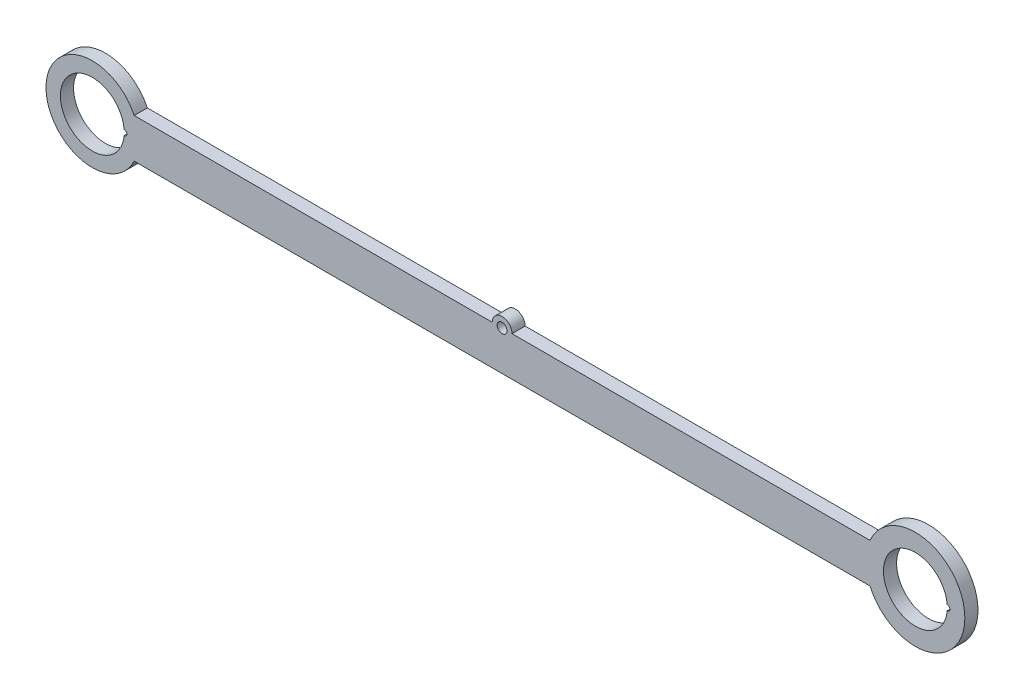
ISO-10303-21;
HEADER;
FILE_DESCRIPTION(('STEP AP214'),'2;1');
FILE_NAME('part.step','',(''),(''),'','','');
FILE_SCHEMA(('AUTOMOTIVE_DESIGN { 1 0 10303 214 1 1 1 1 }'));
ENDSEC;
DATA;
#1=APPLICATION_CONTEXT('core data for automotive mechanical design processes');
#2=APPLICATION_PROTOCOL_DEFINITION('international standard','automotive_design',2000,#1);
#3=PRODUCT_CONTEXT('',#1,'mechanical');
#4=PRODUCT('Part','Part','',(#3));
#5=PRODUCT_RELATED_PRODUCT_CATEGORY('part','',(#4));
#6=PRODUCT_DEFINITION_FORMATION('','',#4);
#7=PRODUCT_DEFINITION_CONTEXT('part definition',#1,'design');
#8=PRODUCT_DEFINITION('design','',#6,#7);
#9=PRODUCT_DEFINITION_SHAPE('','',#8);
#10=(LENGTH_UNIT() NAMED_UNIT(*) SI_UNIT(.MILLI.,.METRE.));
#11=(NAMED_UNIT(*) PLANE_ANGLE_UNIT() SI_UNIT($,.RADIAN.));
#12=(NAMED_UNIT(*) SI_UNIT($,.STERADIAN.) SOLID_ANGLE_UNIT());
#13=UNCERTAINTY_MEASURE_WITH_UNIT(LENGTH_MEASURE(1.E-05),#10,'distance_accuracy_value','');
#14=(GEOMETRIC_REPRESENTATION_CONTEXT(3) GLOBAL_UNCERTAINTY_ASSIGNED_CONTEXT((#13)) GLOBAL_UNIT_ASSIGNED_CONTEXT((#10,
#11,#12)) REPRESENTATION_CONTEXT('',''));
#15=CARTESIAN_POINT('',(0.,0.,0.));
#16=DIRECTION('',(0.,0.,1.));
#17=DIRECTION('',(1.,0.,0.));
#18=AXIS2_PLACEMENT_3D('',#15,#16,#17);
#19=CARTESIAN_POINT('',(0.,0.,4.));
#20=DIRECTION('',(0.,0.,-1.));
#21=DIRECTION('',(-1.,0.,0.));
#22=AXIS2_PLACEMENT_3D('',#19,#20,#21);
#23=PLANE('',#22);
#24=CARTESIAN_POINT('',(0.,0.,4.));
#25=DIRECTION('',(0.,0.,1.));
#26=DIRECTION('',(-1.,0.,0.));
#27=AXIS2_PLACEMENT_3D('',#24,#25,#26);
#28=CIRCLE('',#27,14.0628919691904);
#29=CARTESIAN_POINT('',(12.718684308415,6.,4.));
#30=VERTEX_POINT('',#29);
#31=CARTESIAN_POINT('',(12.718684308415,-6.,4.));
#32=VERTEX_POINT('',#31);
#33=EDGE_CURVE('E151',#30,#32,#28,.T.);
#34=ORIENTED_EDGE('',*,*,#33,.T.);
#35=DIRECTION('',(1.,0.,0.));
#36=VECTOR('',#35,1.);
#37=CARTESIAN_POINT('',(12.718684308415,-6.,4.));
#38=LINE('',#37,#36);
#39=CARTESIAN_POINT('',(236.224480752541,-5.99999999999999,4.));
#40=VERTEX_POINT('',#39);
#41=EDGE_CURVE('E155',#32,#40,#38,.T.);
#42=ORIENTED_EDGE('',*,*,#41,.T.);
#43=CARTESIAN_POINT('',(250.,0.,4.));
#44=DIRECTION('',(0.,0.,1.));
#45=DIRECTION('',(1.,0.,0.));
#46=AXIS2_PLACEMENT_3D('',#43,#44,#45);
#47=CIRCLE('',#46,15.0254760502661);
#48=CARTESIAN_POINT('',(236.224480752541,6.,4.));
#49=VERTEX_POINT('',#48);
#50=EDGE_CURVE('E159',#40,#49,#47,.T.);
#51=ORIENTED_EDGE('',*,*,#50,.T.);
#52=DIRECTION('',(-1.,0.,0.));
#53=VECTOR('',#52,1.);
#54=CARTESIAN_POINT('',(127.471582530478,6.,4.));
#55=LINE('',#54,#53);
#56=CARTESIAN_POINT('',(127.471582530478,6.,4.));
#57=VERTEX_POINT('',#56);
#58=EDGE_CURVE('E162',#49,#57,#55,.T.);
#59=ORIENTED_EDGE('',*,*,#58,.T.);
#60=CARTESIAN_POINT('',(124.471582530478,6.00000000000001,4.));
#61=DIRECTION('',(0.,0.,1.));
#62=DIRECTION('',(-1.,0.,0.));
#63=AXIS2_PLACEMENT_3D('',#60,#61,#62);
#64=CIRCLE('',#63,3.);
#65=CARTESIAN_POINT('',(121.471582530478,6.,4.));
#66=VERTEX_POINT('',#65);
#67=EDGE_CURVE('E165',#57,#66,#64,.T.);
#68=ORIENTED_EDGE('',*,*,#67,.T.);
#69=DIRECTION('',(-1.,0.,0.));
#70=VECTOR('',#69,1.);
#71=CARTESIAN_POINT('',(121.471582530478,6.,4.));
#72=LINE('',#71,#70);
#73=EDGE_CURVE('E168',#66,#30,#72,.T.);
#74=ORIENTED_EDGE('',*,*,#73,.T.);
#75=EDGE_LOOP('',(#34,#42,#51,#59,#68,#74));
#76=FACE_BOUND('',#75,.T.);
#77=CARTESIAN_POINT('',(0.,0.,4.));
#78=DIRECTION('',(0.,0.,1.));
#79=DIRECTION('',(1.,0.,0.));
#80=AXIS2_PLACEMENT_3D('',#77,#78,#79);
#81=CIRCLE('',#80,9.7);
#82=CARTESIAN_POINT('',(9.66701030927835,0.799319510775317,4.));
#83=VERTEX_POINT('',#82);
#84=CARTESIAN_POINT('',(9.66701030927835,-0.799319510775317,4.));
#85=VERTEX_POINT('',#84);
#86=EDGE_CURVE('E139',#83,#85,#81,.T.);
#87=ORIENTED_EDGE('',*,*,#86,.F.);
#88=CARTESIAN_POINT('',(9.7,0.,4.));
#89=DIRECTION('',(0.,0.,1.));
#90=DIRECTION('',(1.,0.,0.));
#91=AXIS2_PLACEMENT_3D('',#88,#89,#90);
#92=CIRCLE('',#91,0.800000000000001);
#93=EDGE_CURVE('E54',#85,#83,#92,.T.);
#94=ORIENTED_EDGE('',*,*,#93,.F.);
#95=EDGE_LOOP('',(#87,#94));
#96=FACE_BOUND('',#95,.T.);
#97=CARTESIAN_POINT('',(250.,0.,4.));
#98=DIRECTION('',(0.,0.,1.));
#99=DIRECTION('',(1.,0.,0.));
#100=AXIS2_PLACEMENT_3D('',#97,#98,#99);
#101=CIRCLE('',#100,9.7);
#102=CARTESIAN_POINT('',(259.667010309278,0.799319510775326,4.));
#103=VERTEX_POINT('',#102);
#104=CARTESIAN_POINT('',(259.667010309278,-0.799319510775327,4.));
#105=VERTEX_POINT('',#104);
#106=EDGE_CURVE('E128',#103,#105,#101,.T.);
#107=ORIENTED_EDGE('',*,*,#106,.F.);
#108=CARTESIAN_POINT('',(259.7,0.,4.));
#109=DIRECTION('',(0.,0.,1.));
#110=DIRECTION('',(1.,0.,0.));
#111=AXIS2_PLACEMENT_3D('',#108,#109,#110);
#112=CIRCLE('',#111,0.800000000000011);
#113=EDGE_CURVE('E62',#105,#103,#112,.T.);
#114=ORIENTED_EDGE('',*,*,#113,.F.);
#115=EDGE_LOOP('',(#107,#114));
#116=FACE_BOUND('',#115,.T.);
#117=CARTESIAN_POINT('',(124.471582530478,6.,4.));
#118=DIRECTION('',(0.,0.,1.));
#119=DIRECTION('',(1.,0.,0.));
#120=AXIS2_PLACEMENT_3D('',#117,#118,#119);
#121=CIRCLE('',#120,1.5);
#122=CARTESIAN_POINT('',(125.971582530478,6.,4.));
#123=VERTEX_POINT('',#122);
#124=EDGE_CURVE('E141',#123,#123,#121,.T.);
#125=ORIENTED_EDGE('',*,*,#124,.F.);
#126=EDGE_LOOP('',(#125));
#127=FACE_BOUND('',#126,.T.);
#128=ADVANCED_FACE('F39',(#76,#96,#116,#127),#23,.F.);
#129=CARTESIAN_POINT('',(0.,0.,0.));
#130=DIRECTION('',(0.,0.,-1.));
#131=DIRECTION('',(-1.,0.,0.));
#132=AXIS2_PLACEMENT_3D('',#129,#130,#131);
#133=PLANE('',#132);
#134=CARTESIAN_POINT('',(9.7,0.,0.));
#135=DIRECTION('',(0.,0.,-1.));
#136=DIRECTION('',(-1.,0.,0.));
#137=AXIS2_PLACEMENT_3D('',#134,#135,#136);
#138=CIRCLE('',#137,0.800000000000001);
#139=CARTESIAN_POINT('',(9.66701030927835,0.799319510775316,0.));
#140=VERTEX_POINT('',#139);
#141=CARTESIAN_POINT('',(9.66701030927835,-0.79931951077531,0.));
#142=VERTEX_POINT('',#141);
#143=EDGE_CURVE('E216',#140,#142,#138,.T.);
#144=ORIENTED_EDGE('',*,*,#143,.F.);
#145=CARTESIAN_POINT('',(0.,0.,0.));
#146=DIRECTION('',(0.,0.,1.));
#147=DIRECTION('',(1.,0.,0.));
#148=AXIS2_PLACEMENT_3D('',#145,#146,#147);
#149=CIRCLE('',#148,9.7);
#150=EDGE_CURVE('E133',#140,#142,#149,.T.);
#151=ORIENTED_EDGE('',*,*,#150,.T.);
#152=EDGE_LOOP('',(#144,#151));
#153=FACE_BOUND('',#152,.T.);
#154=CARTESIAN_POINT('',(259.7,0.,0.));
#155=DIRECTION('',(0.,0.,-1.));
#156=DIRECTION('',(-1.,0.,0.));
#157=AXIS2_PLACEMENT_3D('',#154,#155,#156);
#158=CIRCLE('',#157,0.800000000000011);
#159=CARTESIAN_POINT('',(259.667010309278,0.799319510775328,0.));
#160=VERTEX_POINT('',#159);
#161=CARTESIAN_POINT('',(259.667010309278,-0.799319510775326,0.));
#162=VERTEX_POINT('',#161);
#163=EDGE_CURVE('E117',#160,#162,#158,.T.);
#164=ORIENTED_EDGE('',*,*,#163,.F.);
#165=CARTESIAN_POINT('',(250.,0.,0.));
#166=DIRECTION('',(0.,0.,1.));
#167=DIRECTION('',(1.,0.,0.));
#168=AXIS2_PLACEMENT_3D('',#165,#166,#167);
#169=CIRCLE('',#168,9.7);
#170=EDGE_CURVE('E134',#160,#162,#169,.T.);
#171=ORIENTED_EDGE('',*,*,#170,.T.);
#172=EDGE_LOOP('',(#164,#171));
#173=FACE_BOUND('',#172,.T.);
#174=CARTESIAN_POINT('',(0.,0.,0.));
#175=DIRECTION('',(0.,0.,1.));
#176=DIRECTION('',(-1.,0.,0.));
#177=AXIS2_PLACEMENT_3D('',#174,#175,#176);
#178=CIRCLE('',#177,14.0628919691904);
#179=CARTESIAN_POINT('',(12.718684308415,6.,0.));
#180=VERTEX_POINT('',#179);
#181=CARTESIAN_POINT('',(12.718684308415,-6.,0.));
#182=VERTEX_POINT('',#181);
#183=EDGE_CURVE('E149',#180,#182,#178,.T.);
#184=ORIENTED_EDGE('',*,*,#183,.F.);
#185=DIRECTION('',(-1.,0.,0.));
#186=VECTOR('',#185,1.);
#187=CARTESIAN_POINT('',(121.471582530478,6.,0.));
#188=LINE('',#187,#186);
#189=CARTESIAN_POINT('',(121.471582530478,6.,0.));
#190=VERTEX_POINT('',#189);
#191=EDGE_CURVE('E156',#190,#180,#188,.T.);
#192=ORIENTED_EDGE('',*,*,#191,.F.);
#193=CARTESIAN_POINT('',(124.471582530478,6.00000000000001,0.));
#194=DIRECTION('',(0.,0.,1.));
#195=DIRECTION('',(-1.,0.,0.));
#196=AXIS2_PLACEMENT_3D('',#193,#194,#195);
#197=CIRCLE('',#196,3.);
#198=CARTESIAN_POINT('',(127.471582530478,6.,0.));
#199=VERTEX_POINT('',#198);
#200=EDGE_CURVE('E184',#199,#190,#197,.T.);
#201=ORIENTED_EDGE('',*,*,#200,.F.);
#202=DIRECTION('',(-1.,0.,0.));
#203=VECTOR('',#202,1.);
#204=CARTESIAN_POINT('',(127.471582530478,6.,0.));
#205=LINE('',#204,#203);
#206=CARTESIAN_POINT('',(236.224480752541,6.,0.));
#207=VERTEX_POINT('',#206);
#208=EDGE_CURVE('E181',#207,#199,#205,.T.);
#209=ORIENTED_EDGE('',*,*,#208,.F.);
#210=CARTESIAN_POINT('',(250.,0.,0.));
#211=DIRECTION('',(0.,0.,1.));
#212=DIRECTION('',(1.,0.,0.));
#213=AXIS2_PLACEMENT_3D('',#210,#211,#212);
#214=CIRCLE('',#213,15.0254760502661);
#215=CARTESIAN_POINT('',(236.224480752541,-5.99999999999999,0.));
#216=VERTEX_POINT('',#215);
#217=EDGE_CURVE('E178',#216,#207,#214,.T.);
#218=ORIENTED_EDGE('',*,*,#217,.F.);
#219=DIRECTION('',(1.,0.,0.));
#220=VECTOR('',#219,1.);
#221=CARTESIAN_POINT('',(12.718684308415,-6.,0.));
#222=LINE('',#221,#220);
#223=EDGE_CURVE('E175',#182,#216,#222,.T.);
#224=ORIENTED_EDGE('',*,*,#223,.F.);
#225=EDGE_LOOP('',(#184,#192,#201,#209,#218,#224));
#226=FACE_BOUND('',#225,.T.);
#227=CARTESIAN_POINT('',(124.471582530478,6.,0.));
#228=DIRECTION('',(0.,0.,1.));
#229=DIRECTION('',(1.,0.,0.));
#230=AXIS2_PLACEMENT_3D('',#227,#228,#229);
#231=CIRCLE('',#230,1.5);
#232=CARTESIAN_POINT('',(125.971582530478,6.,0.));
#233=VERTEX_POINT('',#232);
#234=EDGE_CURVE('E144',#233,#233,#231,.T.);
#235=ORIENTED_EDGE('',*,*,#234,.T.);
#236=EDGE_LOOP('',(#235));
#237=FACE_BOUND('',#236,.T.);
#238=ADVANCED_FACE('F222',(#153,#173,#226,#237),#133,.T.);
#239=CARTESIAN_POINT('',(0.,0.,4.));
#240=DIRECTION('',(0.,0.,-1.));
#241=DIRECTION('',(-1.,0.,0.));
#242=AXIS2_PLACEMENT_3D('',#239,#240,#241);
#243=CYLINDRICAL_SURFACE('',#242,14.0628919691904);
#244=ORIENTED_EDGE('',*,*,#183,.T.);
#245=DIRECTION('',(0.,0.,-1.));
#246=VECTOR('',#245,1.);
#247=CARTESIAN_POINT('',(12.718684308415,-6.,4.));
#248=LINE('',#247,#246);
#249=EDGE_CURVE('E208',#32,#182,#248,.T.);
#250=ORIENTED_EDGE('',*,*,#249,.F.);
#251=ORIENTED_EDGE('',*,*,#33,.F.);
#252=DIRECTION('',(0.,0.,-1.));
#253=VECTOR('',#252,1.);
#254=CARTESIAN_POINT('',(12.718684308415,6.,4.));
#255=LINE('',#254,#253);
#256=EDGE_CURVE('E171',#30,#180,#255,.T.);
#257=ORIENTED_EDGE('',*,*,#256,.T.);
#258=EDGE_LOOP('',(#244,#250,#251,#257));
#259=FACE_BOUND('',#258,.T.);
#260=ADVANCED_FACE('F41',(#259),#243,.T.);
#261=CARTESIAN_POINT('',(12.718684308415,-6.,4.));
#262=DIRECTION('',(0.,1.,0.));
#263=DIRECTION('',(0.,0.,1.));
#264=AXIS2_PLACEMENT_3D('',#261,#262,#263);
#265=PLANE('',#264);
#266=ORIENTED_EDGE('',*,*,#223,.T.);
#267=DIRECTION('',(0.,0.,-1.));
#268=VECTOR('',#267,1.);
#269=CARTESIAN_POINT('',(236.224480752541,-5.99999999999999,4.));
#270=LINE('',#269,#268);
#271=EDGE_CURVE('E204',#40,#216,#270,.T.);
#272=ORIENTED_EDGE('',*,*,#271,.F.);
#273=ORIENTED_EDGE('',*,*,#41,.F.);
#274=ORIENTED_EDGE('',*,*,#249,.T.);
#275=EDGE_LOOP('',(#266,#272,#273,#274));
#276=FACE_BOUND('',#275,.T.);
#277=ADVANCED_FACE('F273',(#276),#265,.F.);
#278=CARTESIAN_POINT('',(250.,0.,4.));
#279=DIRECTION('',(0.,0.,-1.));
#280=DIRECTION('',(-1.,0.,0.));
#281=AXIS2_PLACEMENT_3D('',#278,#279,#280);
#282=CYLINDRICAL_SURFACE('',#281,15.0254760502661);
#283=ORIENTED_EDGE('',*,*,#217,.T.);
#284=DIRECTION('',(0.,0.,-1.));
#285=VECTOR('',#284,1.);
#286=CARTESIAN_POINT('',(236.224480752541,6.,4.));
#287=LINE('',#286,#285);
#288=EDGE_CURVE('E200',#49,#207,#287,.T.);
#289=ORIENTED_EDGE('',*,*,#288,.F.);
#290=ORIENTED_EDGE('',*,*,#50,.F.);
#291=ORIENTED_EDGE('',*,*,#271,.T.);
#292=EDGE_LOOP('',(#283,#289,#290,#291));
#293=FACE_BOUND('',#292,.T.);
#294=ADVANCED_FACE('F270',(#293),#282,.T.);
#295=CARTESIAN_POINT('',(127.471582530478,6.,4.));
#296=DIRECTION('',(0.,-1.,0.));
#297=DIRECTION('',(0.,0.,-1.));
#298=AXIS2_PLACEMENT_3D('',#295,#296,#297);
#299=PLANE('',#298);
#300=ORIENTED_EDGE('',*,*,#208,.T.);
#301=DIRECTION('',(0.,0.,-1.));
#302=VECTOR('',#301,1.);
#303=CARTESIAN_POINT('',(127.471582530478,6.,4.));
#304=LINE('',#303,#302);
#305=EDGE_CURVE('E196',#57,#199,#304,.T.);
#306=ORIENTED_EDGE('',*,*,#305,.F.);
#307=ORIENTED_EDGE('',*,*,#58,.F.);
#308=ORIENTED_EDGE('',*,*,#288,.T.);
#309=EDGE_LOOP('',(#300,#306,#307,#308));
#310=FACE_BOUND('',#309,.T.);
#311=ADVANCED_FACE('F266',(#310),#299,.F.);
#312=CARTESIAN_POINT('',(124.471582530478,6.00000000000001,4.));
#313=DIRECTION('',(0.,0.,-1.));
#314=DIRECTION('',(-1.,0.,0.));
#315=AXIS2_PLACEMENT_3D('',#312,#313,#314);
#316=CYLINDRICAL_SURFACE('',#315,3.);
#317=ORIENTED_EDGE('',*,*,#200,.T.);
#318=DIRECTION('',(0.,0.,-1.));
#319=VECTOR('',#318,1.);
#320=CARTESIAN_POINT('',(121.471582530478,6.,4.));
#321=LINE('',#320,#319);
#322=EDGE_CURVE('E192',#66,#190,#321,.T.);
#323=ORIENTED_EDGE('',*,*,#322,.F.);
#324=ORIENTED_EDGE('',*,*,#67,.F.);
#325=ORIENTED_EDGE('',*,*,#305,.T.);
#326=EDGE_LOOP('',(#317,#323,#324,#325));
#327=FACE_BOUND('',#326,.T.);
#328=ADVANCED_FACE('F262',(#327),#316,.T.);
#329=CARTESIAN_POINT('',(121.471582530478,6.,4.));
#330=DIRECTION('',(0.,-1.,0.));
#331=DIRECTION('',(0.,0.,-1.));
#332=AXIS2_PLACEMENT_3D('',#329,#330,#331);
#333=PLANE('',#332);
#334=ORIENTED_EDGE('',*,*,#191,.T.);
#335=ORIENTED_EDGE('',*,*,#256,.F.);
#336=ORIENTED_EDGE('',*,*,#73,.F.);
#337=ORIENTED_EDGE('',*,*,#322,.T.);
#338=EDGE_LOOP('',(#334,#335,#336,#337));
#339=FACE_BOUND('',#338,.T.);
#340=ADVANCED_FACE('F259',(#339),#333,.F.);
#341=CARTESIAN_POINT('',(0.,0.,4.));
#342=DIRECTION('',(0.,0.,-1.));
#343=DIRECTION('',(-1.,0.,0.));
#344=AXIS2_PLACEMENT_3D('',#341,#342,#343);
#345=CYLINDRICAL_SURFACE('',#344,9.7);
#346=DIRECTION('',(0.,0.,1.));
#347=VECTOR('',#346,1.);
#348=CARTESIAN_POINT('',(9.66701030927835,-0.799319510775316,-1.));
#349=LINE('',#348,#347);
#350=EDGE_CURVE('E11',#142,#85,#349,.T.);
#351=ORIENTED_EDGE('',*,*,#350,.F.);
#352=ORIENTED_EDGE('',*,*,#150,.F.);
#353=DIRECTION('',(0.,0.,1.));
#354=VECTOR('',#353,1.);
#355=CARTESIAN_POINT('',(9.66701030927835,0.799319510775316,-1.));
#356=LINE('',#355,#354);
#357=EDGE_CURVE('E48',#83,#140,#356,.F.);
#358=ORIENTED_EDGE('',*,*,#357,.F.);
#359=ORIENTED_EDGE('',*,*,#86,.T.);
#360=EDGE_LOOP('',(#351,#352,#358,#359));
#361=FACE_BOUND('',#360,.T.);
#362=ADVANCED_FACE('F226',(#361),#345,.F.);
#363=CARTESIAN_POINT('',(250.,0.,4.));
#364=DIRECTION('',(0.,0.,-1.));
#365=DIRECTION('',(-1.,0.,0.));
#366=AXIS2_PLACEMENT_3D('',#363,#364,#365);
#367=CYLINDRICAL_SURFACE('',#366,9.7);
#368=DIRECTION('',(0.,0.,1.));
#369=VECTOR('',#368,1.);
#370=CARTESIAN_POINT('',(259.667010309278,-0.799319510775327,-1.));
#371=LINE('',#370,#369);
#372=EDGE_CURVE('E114',#162,#105,#371,.T.);
#373=ORIENTED_EDGE('',*,*,#372,.F.);
#374=ORIENTED_EDGE('',*,*,#170,.F.);
#375=DIRECTION('',(0.,0.,1.));
#376=VECTOR('',#375,1.);
#377=CARTESIAN_POINT('',(259.667010309278,0.799319510775327,-1.));
#378=LINE('',#377,#376);
#379=EDGE_CURVE('E123',#103,#160,#378,.F.);
#380=ORIENTED_EDGE('',*,*,#379,.F.);
#381=ORIENTED_EDGE('',*,*,#106,.T.);
#382=EDGE_LOOP('',(#373,#374,#380,#381));
#383=FACE_BOUND('',#382,.T.);
#384=ADVANCED_FACE('F131',(#383),#367,.F.);
#385=CARTESIAN_POINT('',(124.471582530478,6.,4.));
#386=DIRECTION('',(0.,0.,-1.));
#387=DIRECTION('',(-1.,0.,0.));
#388=AXIS2_PLACEMENT_3D('',#385,#386,#387);
#389=CYLINDRICAL_SURFACE('',#388,1.5);
#390=ORIENTED_EDGE('',*,*,#124,.T.);
#391=EDGE_LOOP('',(#390));
#392=FACE_BOUND('',#391,.T.);
#393=ORIENTED_EDGE('',*,*,#234,.F.);
#394=EDGE_LOOP('',(#393));
#395=FACE_BOUND('',#394,.T.);
#396=ADVANCED_FACE('F241',(#392,#395),#389,.F.);
#397=CARTESIAN_POINT('',(259.7,0.,-6.));
#398=DIRECTION('',(0.,0.,1.));
#399=DIRECTION('',(1.,0.,0.));
#400=AXIS2_PLACEMENT_3D('',#397,#398,#399);
#401=CYLINDRICAL_SURFACE('',#400,0.800000000000011);
#402=ORIENTED_EDGE('',*,*,#372,.T.);
#403=ORIENTED_EDGE('',*,*,#113,.T.);
#404=ORIENTED_EDGE('',*,*,#379,.T.);
#405=ORIENTED_EDGE('',*,*,#163,.T.);
#406=EDGE_LOOP('',(#402,#403,#404,#405));
#407=FACE_BOUND('',#406,.T.);
#408=ADVANCED_FACE('F115',(#407),#401,.F.);
#409=CARTESIAN_POINT('',(9.7,0.,-6.));
#410=DIRECTION('',(0.,0.,1.));
#411=DIRECTION('',(1.,0.,0.));
#412=AXIS2_PLACEMENT_3D('',#409,#410,#411);
#413=CYLINDRICAL_SURFACE('',#412,0.800000000000001);
#414=ORIENTED_EDGE('',*,*,#350,.T.);
#415=ORIENTED_EDGE('',*,*,#93,.T.);
#416=ORIENTED_EDGE('',*,*,#357,.T.);
#417=ORIENTED_EDGE('',*,*,#143,.T.);
#418=EDGE_LOOP('',(#414,#415,#416,#417));
#419=FACE_BOUND('',#418,.T.);
#420=ADVANCED_FACE('F215',(#419),#413,.F.);
#421=CLOSED_SHELL('',(#128,#238,#260,#277,#294,#311,#328,#340,#362,#384,#396,#408,#420));
#422=MANIFOLD_SOLID_BREP('B2',#421);
#423=ADVANCED_BREP_SHAPE_REPRESENTATION('',(#18,#422),#14);
#424=SHAPE_DEFINITION_REPRESENTATION(#9,#423);
ENDSEC;
END-ISO-10303-21;
